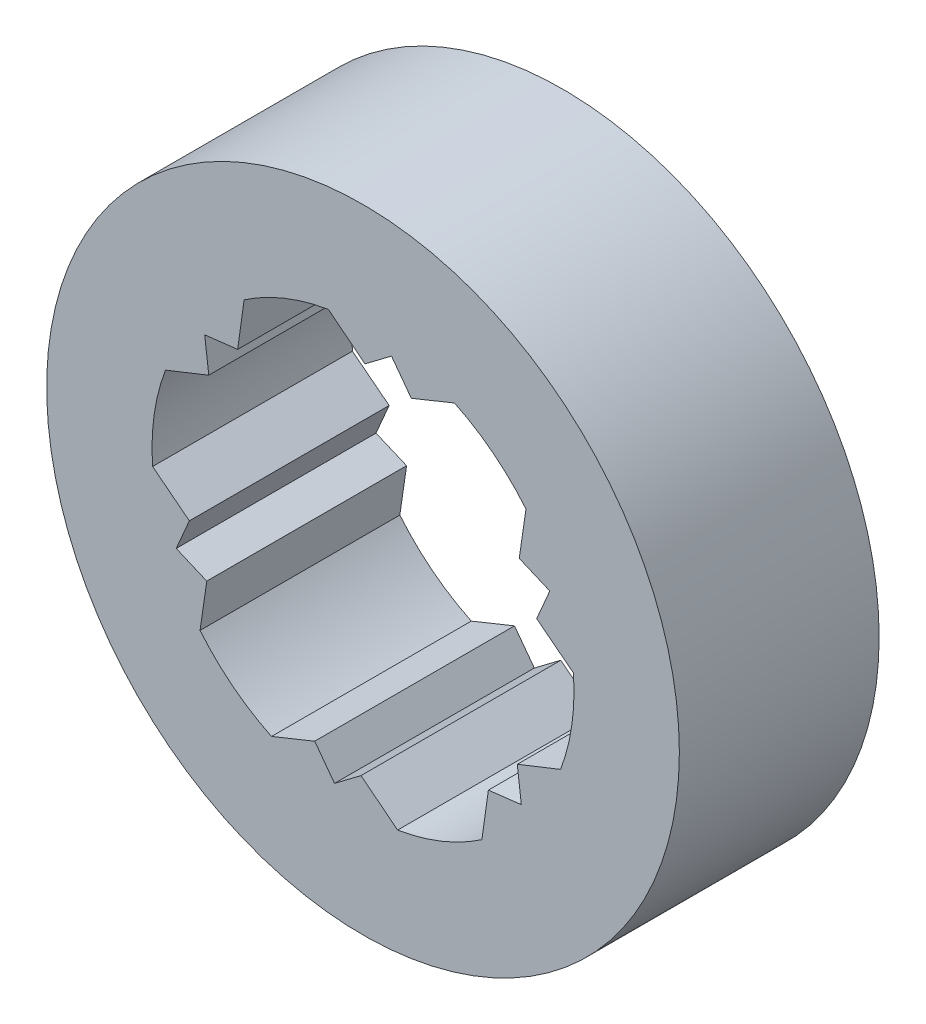
ISO-10303-21;
HEADER;
FILE_DESCRIPTION(('STEP AP214'),'2;1');
FILE_NAME('part.step','',(''),(''),'','','');
FILE_SCHEMA(('AUTOMOTIVE_DESIGN { 1 0 10303 214 1 1 1 1 }'));
ENDSEC;
DATA;
#1=APPLICATION_CONTEXT('core data for automotive mechanical design processes');
#2=APPLICATION_PROTOCOL_DEFINITION('international standard','automotive_design',2000,#1);
#3=PRODUCT_CONTEXT('',#1,'mechanical');
#4=PRODUCT('Part','Part','',(#3));
#5=PRODUCT_RELATED_PRODUCT_CATEGORY('part','',(#4));
#6=PRODUCT_DEFINITION_FORMATION('','',#4);
#7=PRODUCT_DEFINITION_CONTEXT('part definition',#1,'design');
#8=PRODUCT_DEFINITION('design','',#6,#7);
#9=PRODUCT_DEFINITION_SHAPE('','',#8);
#10=(LENGTH_UNIT() NAMED_UNIT(*) SI_UNIT(.MILLI.,.METRE.));
#11=(NAMED_UNIT(*) PLANE_ANGLE_UNIT() SI_UNIT($,.RADIAN.));
#12=(NAMED_UNIT(*) SI_UNIT($,.STERADIAN.) SOLID_ANGLE_UNIT());
#13=UNCERTAINTY_MEASURE_WITH_UNIT(LENGTH_MEASURE(1.E-05),#10,'distance_accuracy_value','');
#14=(GEOMETRIC_REPRESENTATION_CONTEXT(3) GLOBAL_UNCERTAINTY_ASSIGNED_CONTEXT((#13)) GLOBAL_UNIT_ASSIGNED_CONTEXT((#10,
#11,#12)) REPRESENTATION_CONTEXT('',''));
#15=CARTESIAN_POINT('',(0.,0.,0.));
#16=DIRECTION('',(0.,0.,1.));
#17=DIRECTION('',(1.,0.,0.));
#18=AXIS2_PLACEMENT_3D('',#15,#16,#17);
#19=CARTESIAN_POINT('',(-6.12693578866867,33.5955695744337,3.));
#20=DIRECTION('',(0.,0.,1.));
#21=DIRECTION('',(1.,0.,0.));
#22=AXIS2_PLACEMENT_3D('',#19,#20,#21);
#23=PLANE('',#22);
#24=CARTESIAN_POINT('',(-6.12693578866867,33.5955695744337,3.));
#25=DIRECTION('',(0.,0.,1.));
#26=DIRECTION('',(1.,0.,0.));
#27=AXIS2_PLACEMENT_3D('',#24,#25,#26);
#28=CIRCLE('',#27,4.74999999999999);
#29=CARTESIAN_POINT('',(-1.37693578866867,33.5955695744337,3.));
#30=VERTEX_POINT('',#29);
#31=EDGE_CURVE('E11',#30,#30,#28,.T.);
#32=ORIENTED_EDGE('',*,*,#31,.T.);
#33=EDGE_LOOP('',(#32));
#34=FACE_BOUND('',#33,.T.);
#35=DIRECTION('',(0.138449327742475,0.990369518739171,0.));
#36=VECTOR('',#35,1.);
#37=CARTESIAN_POINT('',(-4.24474359939464,31.6712928608779,3.));
#38=LINE('',#37,#36);
#39=CARTESIAN_POINT('',(-4.34165812881437,30.9780341977605,3.));
#40=VERTEX_POINT('',#39);
#41=CARTESIAN_POINT('',(-4.24474359939464,31.6712928608779,3.));
#42=VERTEX_POINT('',#41);
#43=EDGE_CURVE('E244',#40,#42,#38,.T.);
#44=ORIENTED_EDGE('',*,*,#43,.F.);
#45=CARTESIAN_POINT('',(-6.12693578866867,33.5955695744337,3.));
#46=DIRECTION('',(0.,0.,1.));
#47=DIRECTION('',(-1.,0.,0.));
#48=AXIS2_PLACEMENT_3D('',#45,#46,#47);
#49=CIRCLE('',#48,3.16839198504707);
#50=CARTESIAN_POINT('',(-5.60741686881472,30.4700603578701,3.));
#51=VERTEX_POINT('',#50);
#52=EDGE_CURVE('E236',#51,#40,#49,.T.);
#53=ORIENTED_EDGE('',*,*,#52,.F.);
#54=DIRECTION('',(0.784681674795164,-0.619898918567097,0.));
#55=VECTOR('',#54,1.);
#56=CARTESIAN_POINT('',(-6.15669404117133,30.903989600867,3.));
#57=LINE('',#56,#55);
#58=CARTESIAN_POINT('',(-6.15669404117133,30.903989600867,3.));
#59=VERTEX_POINT('',#58);
#60=EDGE_CURVE('E312',#59,#51,#57,.T.);
#61=ORIENTED_EDGE('',*,*,#60,.F.);
#62=DIRECTION('',(0.798195461078353,0.602398544083496,0.));
#63=VECTOR('',#62,1.);
#64=CARTESIAN_POINT('',(-6.55451593583498,30.6037532028472,3.));
#65=LINE('',#64,#63);
#66=CARTESIAN_POINT('',(-6.55451593583498,30.6037532028472,3.));
#67=VERTEX_POINT('',#66);
#68=EDGE_CURVE('E310',#67,#59,#65,.T.);
#69=ORIENTED_EDGE('',*,*,#68,.F.);
#70=DIRECTION('',(0.597502648936795,-0.801866936912549,0.));
#71=VECTOR('',#70,1.);
#72=CARTESIAN_POINT('',(-6.85231221188178,31.0034049669398,3.));
#73=LINE('',#72,#71);
#74=CARTESIAN_POINT('',(-6.85231221188178,31.0034049669398,3.));
#75=VERTEX_POINT('',#74);
#76=EDGE_CURVE('E308',#75,#67,#73,.T.);
#77=ORIENTED_EDGE('',*,*,#76,.F.);
#78=DIRECTION('',(0.926909826233128,0.375284124407726,0.));
#79=VECTOR('',#78,1.);
#80=CARTESIAN_POINT('',(-6.85231221188178,31.0034049669398,3.));
#81=LINE('',#80,#79);
#82=CARTESIAN_POINT('',(-7.50114909024496,30.7407060798544,3.));
#83=VERTEX_POINT('',#82);
#84=EDGE_CURVE('E306',#83,#75,#81,.T.);
#85=ORIENTED_EDGE('',*,*,#84,.F.);
#86=CARTESIAN_POINT('',(-6.12693578866867,33.5955695744337,3.));
#87=DIRECTION('',(0.,0.,1.));
#88=DIRECTION('',(1.,0.,0.));
#89=AXIS2_PLACEMENT_3D('',#86,#87,#88);
#90=CIRCLE('',#89,3.16839198504705);
#91=CARTESIAN_POINT('',(-8.5739467100482,31.5828983838117,3.));
#92=VERTEX_POINT('',#91);
#93=EDGE_CURVE('E304',#92,#83,#90,.T.);
#94=ORIENTED_EDGE('',*,*,#93,.F.);
#95=DIRECTION('',(-0.144507373860024,-0.98950372354028,0.));
#96=VECTOR('',#95,1.);
#97=CARTESIAN_POINT('',(-8.47279154834618,32.2755509902899,3.));
#98=LINE('',#97,#96);
#99=CARTESIAN_POINT('',(-8.47279154834618,32.2755509902899,3.));
#100=VERTEX_POINT('',#99);
#101=EDGE_CURVE('E302',#100,#92,#98,.T.);
#102=ORIENTED_EDGE('',*,*,#101,.F.);
#103=DIRECTION('',(0.920790172918248,-0.39005827443753,0.));
#104=VECTOR('',#103,1.);
#105=CARTESIAN_POINT('',(-8.9317148435039,32.4699566582404,3.));
#106=LINE('',#105,#104);
#107=CARTESIAN_POINT('',(-8.9317148435039,32.4699566582404,3.));
#108=VERTEX_POINT('',#107);
#109=EDGE_CURVE('E300',#108,#100,#106,.T.);
#110=ORIENTED_EDGE('',*,*,#109,.F.);
#111=DIRECTION('',(-0.395685813352689,-0.918385941264031,0.));
#112=VECTOR('',#111,1.);
#113=CARTESIAN_POINT('',(-8.73450440115582,32.9276816804956,3.));
#114=LINE('',#113,#112);
#115=CARTESIAN_POINT('',(-8.73450440115582,32.9276816804956,3.));
#116=VERTEX_POINT('',#115);
#117=EDGE_CURVE('E298',#116,#108,#114,.T.);
#118=ORIENTED_EDGE('',*,*,#117,.F.);
#119=DIRECTION('',(0.788460498490648,-0.615085394331453,0.));
#120=VECTOR('',#119,1.);
#121=CARTESIAN_POINT('',(-8.73450440115582,32.9276816804956,3.));
#122=LINE('',#121,#120);
#123=CARTESIAN_POINT('',(-9.28642675009927,33.3582414565276,3.));
#124=VERTEX_POINT('',#123);
#125=EDGE_CURVE('E296',#124,#116,#122,.T.);
#126=ORIENTED_EDGE('',*,*,#125,.F.);
#127=CARTESIAN_POINT('',(-6.12693578866867,33.5955695744337,3.));
#128=DIRECTION('',(0.,0.,1.));
#129=DIRECTION('',(1.,0.,0.));
#130=AXIS2_PLACEMENT_3D('',#127,#128,#129);
#131=CIRCLE('',#130,3.16839198504707);
#132=CARTESIAN_POINT('',(-9.09346562990216,34.7084076003753,3.));
#133=VERTEX_POINT('',#132);
#134=EDGE_CURVE('E294',#133,#124,#131,.T.);
#135=ORIENTED_EDGE('',*,*,#134,.F.);
#136=DIRECTION('',(-0.929189048655193,-0.369604804973173,0.));
#137=VECTOR('',#136,1.);
#138=CARTESIAN_POINT('',(-8.44303329584353,34.9671309638565,3.));
#139=LINE('',#138,#137);
#140=CARTESIAN_POINT('',(-8.44303329584353,34.9671309638565,3.));
#141=VERTEX_POINT('',#140);
#142=EDGE_CURVE('E292',#141,#133,#139,.T.);
#143=ORIENTED_EDGE('',*,*,#142,.F.);
#144=DIRECTION('',(0.122594711839903,-0.992456818521033,0.));
#145=VECTOR('',#144,1.);
#146=CARTESIAN_POINT('',(-8.5041346963376,35.4617730298268,3.));
#147=LINE('',#146,#145);
#148=CARTESIAN_POINT('',(-8.5041346963376,35.4617730298268,3.));
#149=VERTEX_POINT('',#148);
#150=EDGE_CURVE('E290',#149,#141,#147,.T.);
#151=ORIENTED_EDGE('',*,*,#150,.F.);
#152=DIRECTION('',(-0.993188462289481,-0.116519004351459,0.));
#153=VECTOR('',#152,1.);
#154=CARTESIAN_POINT('',(-8.00912797794273,35.5198462879894,3.));
#155=LINE('',#154,#153);
#156=CARTESIAN_POINT('',(-8.00912797794273,35.5198462879894,3.));
#157=VERTEX_POINT('',#156);
#158=EDGE_CURVE('E288',#157,#149,#155,.T.);
#159=ORIENTED_EDGE('',*,*,#158,.F.);
#160=DIRECTION('',(-0.138449327742475,-0.990369518739171,0.));
#161=VECTOR('',#160,1.);
#162=CARTESIAN_POINT('',(-8.00912797794273,35.5198462879894,3.));
#163=LINE('',#162,#161);
#164=CARTESIAN_POINT('',(-7.91221344852299,36.2131049511069,3.));
#165=VERTEX_POINT('',#164);
#166=EDGE_CURVE('E286',#165,#157,#163,.T.);
#167=ORIENTED_EDGE('',*,*,#166,.F.);
#168=CARTESIAN_POINT('',(-6.1269357886687,33.5955695744337,3.));
#169=DIRECTION('',(0.,0.,1.));
#170=DIRECTION('',(1.,0.,0.));
#171=AXIS2_PLACEMENT_3D('',#168,#169,#170);
#172=CIRCLE('',#171,3.16839198504705);
#173=CARTESIAN_POINT('',(-6.64645470852264,36.7210787909973,3.));
#174=VERTEX_POINT('',#173);
#175=EDGE_CURVE('E284',#174,#165,#172,.T.);
#176=ORIENTED_EDGE('',*,*,#175,.F.);
#177=DIRECTION('',(-0.784681674795159,0.619898918567104,0.));
#178=VECTOR('',#177,1.);
#179=CARTESIAN_POINT('',(-6.09717753616604,36.2871495480004,3.));
#180=LINE('',#179,#178);
#181=CARTESIAN_POINT('',(-6.09717753616604,36.2871495480004,3.));
#182=VERTEX_POINT('',#181);
#183=EDGE_CURVE('E282',#182,#174,#180,.T.);
#184=ORIENTED_EDGE('',*,*,#183,.F.);
#185=DIRECTION('',(-0.798195461078344,-0.602398544083508,0.));
#186=VECTOR('',#185,1.);
#187=CARTESIAN_POINT('',(-5.69935564150239,36.5873859460202,3.));
#188=LINE('',#187,#186);
#189=CARTESIAN_POINT('',(-5.69935564150239,36.5873859460202,3.));
#190=VERTEX_POINT('',#189);
#191=EDGE_CURVE('E280',#190,#182,#188,.T.);
#192=ORIENTED_EDGE('',*,*,#191,.F.);
#193=DIRECTION('',(-0.597502648936788,0.801866936912554,0.));
#194=VECTOR('',#193,1.);
#195=CARTESIAN_POINT('',(-5.40155936545559,36.1877341819275,3.));
#196=LINE('',#195,#194);
#197=CARTESIAN_POINT('',(-5.40155936545559,36.1877341819275,3.));
#198=VERTEX_POINT('',#197);
#199=EDGE_CURVE('E278',#198,#190,#196,.T.);
#200=ORIENTED_EDGE('',*,*,#199,.F.);
#201=DIRECTION('',(-0.926909826233127,-0.375284124407727,0.));
#202=VECTOR('',#201,1.);
#203=CARTESIAN_POINT('',(-5.40155936545559,36.1877341819275,3.));
#204=LINE('',#203,#202);
#205=CARTESIAN_POINT('',(-4.7527224870924,36.4504330690129,3.));
#206=VERTEX_POINT('',#205);
#207=EDGE_CURVE('E276',#206,#198,#204,.T.);
#208=ORIENTED_EDGE('',*,*,#207,.F.);
#209=CARTESIAN_POINT('',(-6.1269357886687,33.5955695744337,3.));
#210=DIRECTION('',(0.,0.,1.));
#211=DIRECTION('',(1.,0.,0.));
#212=AXIS2_PLACEMENT_3D('',#209,#210,#211);
#213=CIRCLE('',#212,3.16839198504707);
#214=CARTESIAN_POINT('',(-3.67992486728916,35.6082407650557,3.));
#215=VERTEX_POINT('',#214);
#216=EDGE_CURVE('E274',#215,#206,#213,.T.);
#217=ORIENTED_EDGE('',*,*,#216,.F.);
#218=DIRECTION('',(0.14450737386002,0.989503723540281,0.));
#219=VECTOR('',#218,1.);
#220=CARTESIAN_POINT('',(-3.78108002899118,34.9155881585775,3.));
#221=LINE('',#220,#219);
#222=CARTESIAN_POINT('',(-3.78108002899118,34.9155881585775,3.));
#223=VERTEX_POINT('',#222);
#224=EDGE_CURVE('E272',#223,#215,#221,.T.);
#225=ORIENTED_EDGE('',*,*,#224,.F.);
#226=DIRECTION('',(-0.920790172918252,0.390058274437518,0.));
#227=VECTOR('',#226,1.);
#228=CARTESIAN_POINT('',(-3.32215673383346,34.721182490627,3.));
#229=LINE('',#228,#227);
#230=CARTESIAN_POINT('',(-3.32215673383346,34.721182490627,3.));
#231=VERTEX_POINT('',#230);
#232=EDGE_CURVE('E270',#231,#223,#229,.T.);
#233=ORIENTED_EDGE('',*,*,#232,.F.);
#234=DIRECTION('',(0.39568581335269,0.918385941264031,0.));
#235=VECTOR('',#234,1.);
#236=CARTESIAN_POINT('',(-3.51936717618154,34.2634574683718,3.));
#237=LINE('',#236,#235);
#238=CARTESIAN_POINT('',(-3.51936717618154,34.2634574683718,3.));
#239=VERTEX_POINT('',#238);
#240=EDGE_CURVE('E268',#239,#231,#237,.T.);
#241=ORIENTED_EDGE('',*,*,#240,.F.);
#242=DIRECTION('',(-0.788460498490652,0.615085394331447,0.));
#243=VECTOR('',#242,1.);
#244=CARTESIAN_POINT('',(-3.51936717618154,34.2634574683718,3.));
#245=LINE('',#244,#243);
#246=CARTESIAN_POINT('',(-2.96744482723809,33.8328976923398,3.));
#247=VERTEX_POINT('',#246);
#248=EDGE_CURVE('E266',#247,#239,#245,.T.);
#249=ORIENTED_EDGE('',*,*,#248,.F.);
#250=CARTESIAN_POINT('',(-6.12693578866867,33.5955695744337,3.));
#251=DIRECTION('',(0.,0.,1.));
#252=DIRECTION('',(1.,0.,0.));
#253=AXIS2_PLACEMENT_3D('',#250,#251,#252);
#254=CIRCLE('',#253,3.16839198504705);
#255=CARTESIAN_POINT('',(-3.1604059474352,32.4827315484921,3.));
#256=VERTEX_POINT('',#255);
#257=EDGE_CURVE('E264',#256,#247,#254,.T.);
#258=ORIENTED_EDGE('',*,*,#257,.F.);
#259=DIRECTION('',(0.929189048655189,0.369604804973182,0.));
#260=VECTOR('',#259,1.);
#261=CARTESIAN_POINT('',(-3.81083828149383,32.2240081850108,3.));
#262=LINE('',#261,#260);
#263=CARTESIAN_POINT('',(-3.81083828149383,32.2240081850108,3.));
#264=VERTEX_POINT('',#263);
#265=EDGE_CURVE('E262',#264,#256,#262,.T.);
#266=ORIENTED_EDGE('',*,*,#265,.F.);
#267=DIRECTION('',(-0.122594711839907,0.992456818521033,0.));
#268=VECTOR('',#267,1.);
#269=CARTESIAN_POINT('',(-3.74973688099976,31.7293661190405,3.));
#270=LINE('',#269,#268);
#271=CARTESIAN_POINT('',(-3.74973688099976,31.7293661190405,3.));
#272=VERTEX_POINT('',#271);
#273=EDGE_CURVE('E258',#272,#264,#270,.T.);
#274=ORIENTED_EDGE('',*,*,#273,.F.);
#275=DIRECTION('',(0.993188462289478,0.116519004351486,0.));
#276=VECTOR('',#275,1.);
#277=CARTESIAN_POINT('',(-4.24474359939464,31.6712928608779,3.));
#278=LINE('',#277,#276);
#279=EDGE_CURVE('E256',#42,#272,#278,.T.);
#280=ORIENTED_EDGE('',*,*,#279,.F.);
#281=EDGE_LOOP('',(#44,#53,#61,#69,#77,#85,#94,#102,#110,#118,#126,#135,#143,#151,#159,#167,
#176,#184,#192,#200,#208,#217,#225,#233,#241,#249,#258,#266,#274,#280));
#282=FACE_BOUND('',#281,.T.);
#283=ADVANCED_FACE('F39',(#34,#282),#23,.T.);
#284=CARTESIAN_POINT('',(-6.12693578866867,33.5955695744337,0.));
#285=DIRECTION('',(0.,0.,1.));
#286=DIRECTION('',(1.,0.,0.));
#287=AXIS2_PLACEMENT_3D('',#284,#285,#286);
#288=PLANE('',#287);
#289=CARTESIAN_POINT('',(-6.12693578866867,33.5955695744337,0.));
#290=DIRECTION('',(0.,0.,1.));
#291=DIRECTION('',(1.,0.,0.));
#292=AXIS2_PLACEMENT_3D('',#289,#290,#291);
#293=CIRCLE('',#292,4.74999999999999);
#294=CARTESIAN_POINT('',(-1.37693578866867,33.5955695744337,0.));
#295=VERTEX_POINT('',#294);
#296=EDGE_CURVE('E43',#295,#295,#293,.T.);
#297=ORIENTED_EDGE('',*,*,#296,.F.);
#298=EDGE_LOOP('',(#297));
#299=FACE_BOUND('',#298,.T.);
#300=CARTESIAN_POINT('',(-6.12693578866867,33.5955695744337,0.));
#301=DIRECTION('',(0.,0.,1.));
#302=DIRECTION('',(-1.,0.,0.));
#303=AXIS2_PLACEMENT_3D('',#300,#301,#302);
#304=CIRCLE('',#303,3.16839198504707);
#305=CARTESIAN_POINT('',(-5.60741686881472,30.4700603578701,0.));
#306=VERTEX_POINT('',#305);
#307=CARTESIAN_POINT('',(-4.34165812881437,30.9780341977605,0.));
#308=VERTEX_POINT('',#307);
#309=EDGE_CURVE('E62',#306,#308,#304,.T.);
#310=ORIENTED_EDGE('',*,*,#309,.T.);
#311=DIRECTION('',(0.138449327742475,0.990369518739171,0.));
#312=VECTOR('',#311,1.);
#313=CARTESIAN_POINT('',(-4.24474359939464,31.6712928608779,0.));
#314=LINE('',#313,#312);
#315=CARTESIAN_POINT('',(-4.24474359939464,31.6712928608779,0.));
#316=VERTEX_POINT('',#315);
#317=EDGE_CURVE('E251',#308,#316,#314,.T.);
#318=ORIENTED_EDGE('',*,*,#317,.T.);
#319=DIRECTION('',(0.993188462289478,0.116519004351486,0.));
#320=VECTOR('',#319,1.);
#321=CARTESIAN_POINT('',(-4.24474359939464,31.6712928608779,0.));
#322=LINE('',#321,#320);
#323=CARTESIAN_POINT('',(-3.74973688099976,31.7293661190405,0.));
#324=VERTEX_POINT('',#323);
#325=EDGE_CURVE('E316',#316,#324,#322,.T.);
#326=ORIENTED_EDGE('',*,*,#325,.T.);
#327=DIRECTION('',(-0.122594711839907,0.992456818521033,0.));
#328=VECTOR('',#327,1.);
#329=CARTESIAN_POINT('',(-3.74973688099976,31.7293661190405,0.));
#330=LINE('',#329,#328);
#331=CARTESIAN_POINT('',(-3.81083828149383,32.2240081850108,0.));
#332=VERTEX_POINT('',#331);
#333=EDGE_CURVE('E319',#324,#332,#330,.T.);
#334=ORIENTED_EDGE('',*,*,#333,.T.);
#335=DIRECTION('',(0.929189048655189,0.369604804973182,0.));
#336=VECTOR('',#335,1.);
#337=CARTESIAN_POINT('',(-3.81083828149383,32.2240081850108,0.));
#338=LINE('',#337,#336);
#339=CARTESIAN_POINT('',(-3.1604059474352,32.4827315484921,0.));
#340=VERTEX_POINT('',#339);
#341=EDGE_CURVE('E322',#332,#340,#338,.T.);
#342=ORIENTED_EDGE('',*,*,#341,.T.);
#343=CARTESIAN_POINT('',(-6.12693578866867,33.5955695744337,0.));
#344=DIRECTION('',(0.,0.,1.));
#345=DIRECTION('',(1.,0.,0.));
#346=AXIS2_PLACEMENT_3D('',#343,#344,#345);
#347=CIRCLE('',#346,3.16839198504705);
#348=CARTESIAN_POINT('',(-2.96744482723809,33.8328976923398,0.));
#349=VERTEX_POINT('',#348);
#350=EDGE_CURVE('E325',#340,#349,#347,.T.);
#351=ORIENTED_EDGE('',*,*,#350,.T.);
#352=DIRECTION('',(-0.788460498490652,0.615085394331447,0.));
#353=VECTOR('',#352,1.);
#354=CARTESIAN_POINT('',(-3.51936717618154,34.2634574683718,0.));
#355=LINE('',#354,#353);
#356=CARTESIAN_POINT('',(-3.51936717618154,34.2634574683718,0.));
#357=VERTEX_POINT('',#356);
#358=EDGE_CURVE('E328',#349,#357,#355,.T.);
#359=ORIENTED_EDGE('',*,*,#358,.T.);
#360=DIRECTION('',(0.39568581335269,0.918385941264031,0.));
#361=VECTOR('',#360,1.);
#362=CARTESIAN_POINT('',(-3.51936717618154,34.2634574683718,0.));
#363=LINE('',#362,#361);
#364=CARTESIAN_POINT('',(-3.32215673383346,34.721182490627,0.));
#365=VERTEX_POINT('',#364);
#366=EDGE_CURVE('E331',#357,#365,#363,.T.);
#367=ORIENTED_EDGE('',*,*,#366,.T.);
#368=DIRECTION('',(-0.920790172918252,0.390058274437518,0.));
#369=VECTOR('',#368,1.);
#370=CARTESIAN_POINT('',(-3.32215673383346,34.721182490627,0.));
#371=LINE('',#370,#369);
#372=CARTESIAN_POINT('',(-3.78108002899118,34.9155881585775,0.));
#373=VERTEX_POINT('',#372);
#374=EDGE_CURVE('E334',#365,#373,#371,.T.);
#375=ORIENTED_EDGE('',*,*,#374,.T.);
#376=DIRECTION('',(0.14450737386002,0.989503723540281,0.));
#377=VECTOR('',#376,1.);
#378=CARTESIAN_POINT('',(-3.78108002899118,34.9155881585775,0.));
#379=LINE('',#378,#377);
#380=CARTESIAN_POINT('',(-3.67992486728916,35.6082407650557,0.));
#381=VERTEX_POINT('',#380);
#382=EDGE_CURVE('E337',#373,#381,#379,.T.);
#383=ORIENTED_EDGE('',*,*,#382,.T.);
#384=CARTESIAN_POINT('',(-6.1269357886687,33.5955695744337,0.));
#385=DIRECTION('',(0.,0.,1.));
#386=DIRECTION('',(1.,0.,0.));
#387=AXIS2_PLACEMENT_3D('',#384,#385,#386);
#388=CIRCLE('',#387,3.16839198504707);
#389=CARTESIAN_POINT('',(-4.7527224870924,36.4504330690129,0.));
#390=VERTEX_POINT('',#389);
#391=EDGE_CURVE('E340',#381,#390,#388,.T.);
#392=ORIENTED_EDGE('',*,*,#391,.T.);
#393=DIRECTION('',(-0.926909826233127,-0.375284124407727,0.));
#394=VECTOR('',#393,1.);
#395=CARTESIAN_POINT('',(-5.40155936545559,36.1877341819275,0.));
#396=LINE('',#395,#394);
#397=CARTESIAN_POINT('',(-5.40155936545559,36.1877341819275,0.));
#398=VERTEX_POINT('',#397);
#399=EDGE_CURVE('E343',#390,#398,#396,.T.);
#400=ORIENTED_EDGE('',*,*,#399,.T.);
#401=DIRECTION('',(-0.597502648936788,0.801866936912554,0.));
#402=VECTOR('',#401,1.);
#403=CARTESIAN_POINT('',(-5.40155936545559,36.1877341819275,0.));
#404=LINE('',#403,#402);
#405=CARTESIAN_POINT('',(-5.69935564150239,36.5873859460202,0.));
#406=VERTEX_POINT('',#405);
#407=EDGE_CURVE('E346',#398,#406,#404,.T.);
#408=ORIENTED_EDGE('',*,*,#407,.T.);
#409=DIRECTION('',(-0.798195461078344,-0.602398544083508,0.));
#410=VECTOR('',#409,1.);
#411=CARTESIAN_POINT('',(-5.69935564150239,36.5873859460202,0.));
#412=LINE('',#411,#410);
#413=CARTESIAN_POINT('',(-6.09717753616604,36.2871495480004,0.));
#414=VERTEX_POINT('',#413);
#415=EDGE_CURVE('E349',#406,#414,#412,.T.);
#416=ORIENTED_EDGE('',*,*,#415,.T.);
#417=DIRECTION('',(-0.784681674795159,0.619898918567104,0.));
#418=VECTOR('',#417,1.);
#419=CARTESIAN_POINT('',(-6.09717753616604,36.2871495480004,0.));
#420=LINE('',#419,#418);
#421=CARTESIAN_POINT('',(-6.64645470852264,36.7210787909973,0.));
#422=VERTEX_POINT('',#421);
#423=EDGE_CURVE('E352',#414,#422,#420,.T.);
#424=ORIENTED_EDGE('',*,*,#423,.T.);
#425=CARTESIAN_POINT('',(-6.1269357886687,33.5955695744337,0.));
#426=DIRECTION('',(0.,0.,1.));
#427=DIRECTION('',(1.,0.,0.));
#428=AXIS2_PLACEMENT_3D('',#425,#426,#427);
#429=CIRCLE('',#428,3.16839198504705);
#430=CARTESIAN_POINT('',(-7.91221344852299,36.2131049511069,0.));
#431=VERTEX_POINT('',#430);
#432=EDGE_CURVE('E355',#422,#431,#429,.T.);
#433=ORIENTED_EDGE('',*,*,#432,.T.);
#434=DIRECTION('',(-0.138449327742475,-0.990369518739171,0.));
#435=VECTOR('',#434,1.);
#436=CARTESIAN_POINT('',(-8.00912797794273,35.5198462879894,0.));
#437=LINE('',#436,#435);
#438=CARTESIAN_POINT('',(-8.00912797794273,35.5198462879894,0.));
#439=VERTEX_POINT('',#438);
#440=EDGE_CURVE('E358',#431,#439,#437,.T.);
#441=ORIENTED_EDGE('',*,*,#440,.T.);
#442=DIRECTION('',(-0.993188462289481,-0.116519004351459,0.));
#443=VECTOR('',#442,1.);
#444=CARTESIAN_POINT('',(-8.00912797794273,35.5198462879894,0.));
#445=LINE('',#444,#443);
#446=CARTESIAN_POINT('',(-8.5041346963376,35.4617730298268,0.));
#447=VERTEX_POINT('',#446);
#448=EDGE_CURVE('E361',#439,#447,#445,.T.);
#449=ORIENTED_EDGE('',*,*,#448,.T.);
#450=DIRECTION('',(0.122594711839903,-0.992456818521033,0.));
#451=VECTOR('',#450,1.);
#452=CARTESIAN_POINT('',(-8.5041346963376,35.4617730298268,0.));
#453=LINE('',#452,#451);
#454=CARTESIAN_POINT('',(-8.44303329584353,34.9671309638565,0.));
#455=VERTEX_POINT('',#454);
#456=EDGE_CURVE('E364',#447,#455,#453,.T.);
#457=ORIENTED_EDGE('',*,*,#456,.T.);
#458=DIRECTION('',(-0.929189048655193,-0.369604804973173,0.));
#459=VECTOR('',#458,1.);
#460=CARTESIAN_POINT('',(-8.44303329584353,34.9671309638565,0.));
#461=LINE('',#460,#459);
#462=CARTESIAN_POINT('',(-9.09346562990216,34.7084076003753,0.));
#463=VERTEX_POINT('',#462);
#464=EDGE_CURVE('E367',#455,#463,#461,.T.);
#465=ORIENTED_EDGE('',*,*,#464,.T.);
#466=CARTESIAN_POINT('',(-6.12693578866867,33.5955695744337,0.));
#467=DIRECTION('',(0.,0.,1.));
#468=DIRECTION('',(1.,0.,0.));
#469=AXIS2_PLACEMENT_3D('',#466,#467,#468);
#470=CIRCLE('',#469,3.16839198504707);
#471=CARTESIAN_POINT('',(-9.28642675009927,33.3582414565276,0.));
#472=VERTEX_POINT('',#471);
#473=EDGE_CURVE('E370',#463,#472,#470,.T.);
#474=ORIENTED_EDGE('',*,*,#473,.T.);
#475=DIRECTION('',(0.788460498490648,-0.615085394331453,0.));
#476=VECTOR('',#475,1.);
#477=CARTESIAN_POINT('',(-8.73450440115582,32.9276816804956,0.));
#478=LINE('',#477,#476);
#479=CARTESIAN_POINT('',(-8.73450440115582,32.9276816804956,0.));
#480=VERTEX_POINT('',#479);
#481=EDGE_CURVE('E373',#472,#480,#478,.T.);
#482=ORIENTED_EDGE('',*,*,#481,.T.);
#483=DIRECTION('',(-0.395685813352689,-0.918385941264031,0.));
#484=VECTOR('',#483,1.);
#485=CARTESIAN_POINT('',(-8.73450440115582,32.9276816804956,0.));
#486=LINE('',#485,#484);
#487=CARTESIAN_POINT('',(-8.9317148435039,32.4699566582404,0.));
#488=VERTEX_POINT('',#487);
#489=EDGE_CURVE('E376',#480,#488,#486,.T.);
#490=ORIENTED_EDGE('',*,*,#489,.T.);
#491=DIRECTION('',(0.920790172918248,-0.39005827443753,0.));
#492=VECTOR('',#491,1.);
#493=CARTESIAN_POINT('',(-8.9317148435039,32.4699566582404,0.));
#494=LINE('',#493,#492);
#495=CARTESIAN_POINT('',(-8.47279154834618,32.2755509902899,0.));
#496=VERTEX_POINT('',#495);
#497=EDGE_CURVE('E379',#488,#496,#494,.T.);
#498=ORIENTED_EDGE('',*,*,#497,.T.);
#499=DIRECTION('',(-0.144507373860024,-0.98950372354028,0.));
#500=VECTOR('',#499,1.);
#501=CARTESIAN_POINT('',(-8.47279154834618,32.2755509902899,0.));
#502=LINE('',#501,#500);
#503=CARTESIAN_POINT('',(-8.5739467100482,31.5828983838117,0.));
#504=VERTEX_POINT('',#503);
#505=EDGE_CURVE('E382',#496,#504,#502,.T.);
#506=ORIENTED_EDGE('',*,*,#505,.T.);
#507=CARTESIAN_POINT('',(-6.12693578866867,33.5955695744337,0.));
#508=DIRECTION('',(0.,0.,1.));
#509=DIRECTION('',(1.,0.,0.));
#510=AXIS2_PLACEMENT_3D('',#507,#508,#509);
#511=CIRCLE('',#510,3.16839198504705);
#512=CARTESIAN_POINT('',(-7.50114909024496,30.7407060798544,0.));
#513=VERTEX_POINT('',#512);
#514=EDGE_CURVE('E385',#504,#513,#511,.T.);
#515=ORIENTED_EDGE('',*,*,#514,.T.);
#516=DIRECTION('',(0.926909826233128,0.375284124407726,0.));
#517=VECTOR('',#516,1.);
#518=CARTESIAN_POINT('',(-6.85231221188178,31.0034049669398,0.));
#519=LINE('',#518,#517);
#520=CARTESIAN_POINT('',(-6.85231221188178,31.0034049669398,0.));
#521=VERTEX_POINT('',#520);
#522=EDGE_CURVE('E388',#513,#521,#519,.T.);
#523=ORIENTED_EDGE('',*,*,#522,.T.);
#524=DIRECTION('',(0.597502648936795,-0.801866936912549,0.));
#525=VECTOR('',#524,1.);
#526=CARTESIAN_POINT('',(-6.85231221188178,31.0034049669398,0.));
#527=LINE('',#526,#525);
#528=CARTESIAN_POINT('',(-6.55451593583498,30.6037532028472,0.));
#529=VERTEX_POINT('',#528);
#530=EDGE_CURVE('E391',#521,#529,#527,.T.);
#531=ORIENTED_EDGE('',*,*,#530,.T.);
#532=DIRECTION('',(0.798195461078353,0.602398544083496,0.));
#533=VECTOR('',#532,1.);
#534=CARTESIAN_POINT('',(-6.55451593583498,30.6037532028472,0.));
#535=LINE('',#534,#533);
#536=CARTESIAN_POINT('',(-6.15669404117133,30.903989600867,0.));
#537=VERTEX_POINT('',#536);
#538=EDGE_CURVE('E394',#529,#537,#535,.T.);
#539=ORIENTED_EDGE('',*,*,#538,.T.);
#540=DIRECTION('',(0.784681674795164,-0.619898918567097,0.));
#541=VECTOR('',#540,1.);
#542=CARTESIAN_POINT('',(-6.15669404117133,30.903989600867,0.));
#543=LINE('',#542,#541);
#544=EDGE_CURVE('E245',#537,#306,#543,.T.);
#545=ORIENTED_EDGE('',*,*,#544,.T.);
#546=EDGE_LOOP('',(#310,#318,#326,#334,#342,#351,#359,#367,#375,#383,#392,#400,#408,#416,#424,
#433,#441,#449,#457,#465,#474,#482,#490,#498,#506,#515,#523,#531,#539,#545));
#547=FACE_BOUND('',#546,.T.);
#548=ADVANCED_FACE('F459',(#299,#547),#288,.F.);
#549=CARTESIAN_POINT('',(-6.12693578866867,33.5955695744337,3.));
#550=DIRECTION('',(0.,0.,-1.));
#551=DIRECTION('',(-1.,0.,0.));
#552=AXIS2_PLACEMENT_3D('',#549,#550,#551);
#553=CYLINDRICAL_SURFACE('',#552,4.74999999999999);
#554=ORIENTED_EDGE('',*,*,#31,.F.);
#555=EDGE_LOOP('',(#554));
#556=FACE_BOUND('',#555,.T.);
#557=ORIENTED_EDGE('',*,*,#296,.T.);
#558=EDGE_LOOP('',(#557));
#559=FACE_BOUND('',#558,.T.);
#560=ADVANCED_FACE('F41',(#556,#559),#553,.T.);
#561=CARTESIAN_POINT('',(-6.12693578866867,33.5955695744337,3.));
#562=DIRECTION('',(0.,0.,-1.));
#563=DIRECTION('',(-1.,0.,0.));
#564=AXIS2_PLACEMENT_3D('',#561,#562,#563);
#565=CYLINDRICAL_SURFACE('',#564,3.16839198504707);
#566=ORIENTED_EDGE('',*,*,#309,.F.);
#567=DIRECTION('',(0.,0.,-1.));
#568=VECTOR('',#567,1.);
#569=CARTESIAN_POINT('',(-5.60741686881472,30.4700603578701,3.));
#570=LINE('',#569,#568);
#571=EDGE_CURVE('E240',#51,#306,#570,.T.);
#572=ORIENTED_EDGE('',*,*,#571,.F.);
#573=ORIENTED_EDGE('',*,*,#52,.T.);
#574=DIRECTION('',(0.,0.,-1.));
#575=VECTOR('',#574,1.);
#576=CARTESIAN_POINT('',(-4.34165812881437,30.9780341977605,3.));
#577=LINE('',#576,#575);
#578=EDGE_CURVE('E239',#40,#308,#577,.T.);
#579=ORIENTED_EDGE('',*,*,#578,.T.);
#580=EDGE_LOOP('',(#566,#572,#573,#579));
#581=FACE_BOUND('',#580,.T.);
#582=ADVANCED_FACE('F238',(#581),#565,.F.);
#583=CARTESIAN_POINT('',(-4.24474359939464,31.6712928608779,3.));
#584=DIRECTION('',(-0.990369518739171,0.138449327742475,0.));
#585=DIRECTION('',(-0.138449327742475,-0.990369518739171,0.));
#586=AXIS2_PLACEMENT_3D('',#583,#584,#585);
#587=PLANE('',#586);
#588=ORIENTED_EDGE('',*,*,#317,.F.);
#589=ORIENTED_EDGE('',*,*,#578,.F.);
#590=ORIENTED_EDGE('',*,*,#43,.T.);
#591=DIRECTION('',(0.,0.,-1.));
#592=VECTOR('',#591,1.);
#593=CARTESIAN_POINT('',(-4.24474359939464,31.6712928608779,3.));
#594=LINE('',#593,#592);
#595=EDGE_CURVE('E252',#42,#316,#594,.T.);
#596=ORIENTED_EDGE('',*,*,#595,.T.);
#597=EDGE_LOOP('',(#588,#589,#590,#596));
#598=FACE_BOUND('',#597,.T.);
#599=ADVANCED_FACE('F248',(#598),#587,.T.);
#600=CARTESIAN_POINT('',(-4.24474359939464,31.6712928608779,3.));
#601=DIRECTION('',(-0.116519004351486,0.993188462289478,0.));
#602=DIRECTION('',(-0.993188462289478,-0.116519004351486,0.));
#603=AXIS2_PLACEMENT_3D('',#600,#601,#602);
#604=PLANE('',#603);
#605=ORIENTED_EDGE('',*,*,#325,.F.);
#606=ORIENTED_EDGE('',*,*,#595,.F.);
#607=ORIENTED_EDGE('',*,*,#279,.T.);
#608=DIRECTION('',(0.,0.,-1.));
#609=VECTOR('',#608,1.);
#610=CARTESIAN_POINT('',(-3.74973688099976,31.7293661190405,3.));
#611=LINE('',#610,#609);
#612=EDGE_CURVE('E451',#272,#324,#611,.T.);
#613=ORIENTED_EDGE('',*,*,#612,.T.);
#614=EDGE_LOOP('',(#605,#606,#607,#613));
#615=FACE_BOUND('',#614,.T.);
#616=ADVANCED_FACE('F455',(#615),#604,.T.);
#617=CARTESIAN_POINT('',(-3.74973688099976,31.7293661190405,3.));
#618=DIRECTION('',(-0.992456818521033,-0.122594711839907,0.));
#619=DIRECTION('',(0.122594711839907,-0.992456818521033,0.));
#620=AXIS2_PLACEMENT_3D('',#617,#618,#619);
#621=PLANE('',#620);
#622=ORIENTED_EDGE('',*,*,#333,.F.);
#623=ORIENTED_EDGE('',*,*,#612,.F.);
#624=ORIENTED_EDGE('',*,*,#273,.T.);
#625=DIRECTION('',(0.,0.,-1.));
#626=VECTOR('',#625,1.);
#627=CARTESIAN_POINT('',(-3.81083828149383,32.2240081850108,3.));
#628=LINE('',#627,#626);
#629=EDGE_CURVE('E449',#264,#332,#628,.T.);
#630=ORIENTED_EDGE('',*,*,#629,.T.);
#631=EDGE_LOOP('',(#622,#623,#624,#630));
#632=FACE_BOUND('',#631,.T.);
#633=ADVANCED_FACE('F587',(#632),#621,.T.);
#634=CARTESIAN_POINT('',(-3.81083828149383,32.2240081850108,3.));
#635=DIRECTION('',(-0.369604804973182,0.92918904865519,0.));
#636=DIRECTION('',(-0.92918904865519,-0.369604804973182,0.));
#637=AXIS2_PLACEMENT_3D('',#634,#635,#636);
#638=PLANE('',#637);
#639=ORIENTED_EDGE('',*,*,#341,.F.);
#640=ORIENTED_EDGE('',*,*,#629,.F.);
#641=ORIENTED_EDGE('',*,*,#265,.T.);
#642=DIRECTION('',(0.,0.,-1.));
#643=VECTOR('',#642,1.);
#644=CARTESIAN_POINT('',(-3.1604059474352,32.4827315484921,3.));
#645=LINE('',#644,#643);
#646=EDGE_CURVE('E447',#256,#340,#645,.T.);
#647=ORIENTED_EDGE('',*,*,#646,.T.);
#648=EDGE_LOOP('',(#639,#640,#641,#647));
#649=FACE_BOUND('',#648,.T.);
#650=ADVANCED_FACE('F585',(#649),#638,.T.);
#651=CARTESIAN_POINT('',(-6.12693578866867,33.5955695744337,3.));
#652=DIRECTION('',(0.,0.,-1.));
#653=DIRECTION('',(-1.,0.,0.));
#654=AXIS2_PLACEMENT_3D('',#651,#652,#653);
#655=CYLINDRICAL_SURFACE('',#654,3.16839198504705);
#656=ORIENTED_EDGE('',*,*,#350,.F.);
#657=ORIENTED_EDGE('',*,*,#646,.F.);
#658=ORIENTED_EDGE('',*,*,#257,.T.);
#659=DIRECTION('',(0.,0.,-1.));
#660=VECTOR('',#659,1.);
#661=CARTESIAN_POINT('',(-2.96744482723809,33.8328976923398,3.));
#662=LINE('',#661,#660);
#663=EDGE_CURVE('E445',#247,#349,#662,.T.);
#664=ORIENTED_EDGE('',*,*,#663,.T.);
#665=EDGE_LOOP('',(#656,#657,#658,#664));
#666=FACE_BOUND('',#665,.T.);
#667=ADVANCED_FACE('F579',(#666),#655,.F.);
#668=CARTESIAN_POINT('',(-3.51936717618154,34.2634574683718,3.));
#669=DIRECTION('',(-0.615085394331447,-0.788460498490652,0.));
#670=DIRECTION('',(0.788460498490652,-0.615085394331447,0.));
#671=AXIS2_PLACEMENT_3D('',#668,#669,#670);
#672=PLANE('',#671);
#673=ORIENTED_EDGE('',*,*,#358,.F.);
#674=ORIENTED_EDGE('',*,*,#663,.F.);
#675=ORIENTED_EDGE('',*,*,#248,.T.);
#676=DIRECTION('',(0.,0.,-1.));
#677=VECTOR('',#676,1.);
#678=CARTESIAN_POINT('',(-3.51936717618154,34.2634574683718,3.));
#679=LINE('',#678,#677);
#680=EDGE_CURVE('E443',#239,#357,#679,.T.);
#681=ORIENTED_EDGE('',*,*,#680,.T.);
#682=EDGE_LOOP('',(#673,#674,#675,#681));
#683=FACE_BOUND('',#682,.T.);
#684=ADVANCED_FACE('F575',(#683),#672,.T.);
#685=CARTESIAN_POINT('',(-3.51936717618154,34.2634574683718,3.));
#686=DIRECTION('',(-0.918385941264031,0.39568581335269,0.));
#687=DIRECTION('',(-0.39568581335269,-0.918385941264031,0.));
#688=AXIS2_PLACEMENT_3D('',#685,#686,#687);
#689=PLANE('',#688);
#690=ORIENTED_EDGE('',*,*,#366,.F.);
#691=ORIENTED_EDGE('',*,*,#680,.F.);
#692=ORIENTED_EDGE('',*,*,#240,.T.);
#693=DIRECTION('',(0.,0.,-1.));
#694=VECTOR('',#693,1.);
#695=CARTESIAN_POINT('',(-3.32215673383346,34.721182490627,3.));
#696=LINE('',#695,#694);
#697=EDGE_CURVE('E441',#231,#365,#696,.T.);
#698=ORIENTED_EDGE('',*,*,#697,.T.);
#699=EDGE_LOOP('',(#690,#691,#692,#698));
#700=FACE_BOUND('',#699,.T.);
#701=ADVANCED_FACE('F572',(#700),#689,.T.);
#702=CARTESIAN_POINT('',(-3.32215673383346,34.721182490627,3.));
#703=DIRECTION('',(-0.390058274437518,-0.920790172918253,0.));
#704=DIRECTION('',(0.920790172918253,-0.390058274437518,0.));
#705=AXIS2_PLACEMENT_3D('',#702,#703,#704);
#706=PLANE('',#705);
#707=ORIENTED_EDGE('',*,*,#374,.F.);
#708=ORIENTED_EDGE('',*,*,#697,.F.);
#709=ORIENTED_EDGE('',*,*,#232,.T.);
#710=DIRECTION('',(0.,0.,-1.));
#711=VECTOR('',#710,1.);
#712=CARTESIAN_POINT('',(-3.78108002899118,34.9155881585775,3.));
#713=LINE('',#712,#711);
#714=EDGE_CURVE('E439',#223,#373,#713,.T.);
#715=ORIENTED_EDGE('',*,*,#714,.T.);
#716=EDGE_LOOP('',(#707,#708,#709,#715));
#717=FACE_BOUND('',#716,.T.);
#718=ADVANCED_FACE('F564',(#717),#706,.T.);
#719=CARTESIAN_POINT('',(-3.78108002899118,34.9155881585775,3.));
#720=DIRECTION('',(-0.989503723540281,0.14450737386002,0.));
#721=DIRECTION('',(-0.14450737386002,-0.989503723540281,0.));
#722=AXIS2_PLACEMENT_3D('',#719,#720,#721);
#723=PLANE('',#722);
#724=ORIENTED_EDGE('',*,*,#382,.F.);
#725=ORIENTED_EDGE('',*,*,#714,.F.);
#726=ORIENTED_EDGE('',*,*,#224,.T.);
#727=DIRECTION('',(0.,0.,-1.));
#728=VECTOR('',#727,1.);
#729=CARTESIAN_POINT('',(-3.67992486728916,35.6082407650557,3.));
#730=LINE('',#729,#728);
#731=EDGE_CURVE('E437',#215,#381,#730,.T.);
#732=ORIENTED_EDGE('',*,*,#731,.T.);
#733=EDGE_LOOP('',(#724,#725,#726,#732));
#734=FACE_BOUND('',#733,.T.);
#735=ADVANCED_FACE('F560',(#734),#723,.T.);
#736=CARTESIAN_POINT('',(-6.1269357886687,33.5955695744337,3.));
#737=DIRECTION('',(0.,0.,-1.));
#738=DIRECTION('',(-1.,0.,0.));
#739=AXIS2_PLACEMENT_3D('',#736,#737,#738);
#740=CYLINDRICAL_SURFACE('',#739,3.16839198504707);
#741=ORIENTED_EDGE('',*,*,#391,.F.);
#742=ORIENTED_EDGE('',*,*,#731,.F.);
#743=ORIENTED_EDGE('',*,*,#216,.T.);
#744=DIRECTION('',(0.,0.,-1.));
#745=VECTOR('',#744,1.);
#746=CARTESIAN_POINT('',(-4.7527224870924,36.4504330690129,3.));
#747=LINE('',#746,#745);
#748=EDGE_CURVE('E435',#206,#390,#747,.T.);
#749=ORIENTED_EDGE('',*,*,#748,.T.);
#750=EDGE_LOOP('',(#741,#742,#743,#749));
#751=FACE_BOUND('',#750,.T.);
#752=ADVANCED_FACE('F557',(#751),#740,.F.);
#753=CARTESIAN_POINT('',(-5.40155936545559,36.1877341819275,3.));
#754=DIRECTION('',(0.375284124407727,-0.926909826233127,0.));
#755=DIRECTION('',(0.926909826233127,0.375284124407727,0.));
#756=AXIS2_PLACEMENT_3D('',#753,#754,#755);
#757=PLANE('',#756);
#758=ORIENTED_EDGE('',*,*,#399,.F.);
#759=ORIENTED_EDGE('',*,*,#748,.F.);
#760=ORIENTED_EDGE('',*,*,#207,.T.);
#761=DIRECTION('',(0.,0.,-1.));
#762=VECTOR('',#761,1.);
#763=CARTESIAN_POINT('',(-5.40155936545559,36.1877341819275,3.));
#764=LINE('',#763,#762);
#765=EDGE_CURVE('E433',#198,#398,#764,.T.);
#766=ORIENTED_EDGE('',*,*,#765,.T.);
#767=EDGE_LOOP('',(#758,#759,#760,#766));
#768=FACE_BOUND('',#767,.T.);
#769=ADVANCED_FACE('F549',(#768),#757,.T.);
#770=CARTESIAN_POINT('',(-5.40155936545559,36.1877341819275,3.));
#771=DIRECTION('',(-0.801866936912554,-0.597502648936788,0.));
#772=DIRECTION('',(0.597502648936788,-0.801866936912554,0.));
#773=AXIS2_PLACEMENT_3D('',#770,#771,#772);
#774=PLANE('',#773);
#775=ORIENTED_EDGE('',*,*,#407,.F.);
#776=ORIENTED_EDGE('',*,*,#765,.F.);
#777=ORIENTED_EDGE('',*,*,#199,.T.);
#778=DIRECTION('',(0.,0.,-1.));
#779=VECTOR('',#778,1.);
#780=CARTESIAN_POINT('',(-5.69935564150239,36.5873859460202,3.));
#781=LINE('',#780,#779);
#782=EDGE_CURVE('E431',#190,#406,#781,.T.);
#783=ORIENTED_EDGE('',*,*,#782,.T.);
#784=EDGE_LOOP('',(#775,#776,#777,#783));
#785=FACE_BOUND('',#784,.T.);
#786=ADVANCED_FACE('F545',(#785),#774,.T.);
#787=CARTESIAN_POINT('',(-5.69935564150239,36.5873859460202,3.));
#788=DIRECTION('',(0.602398544083508,-0.798195461078344,0.));
#789=DIRECTION('',(0.798195461078344,0.602398544083508,0.));
#790=AXIS2_PLACEMENT_3D('',#787,#788,#789);
#791=PLANE('',#790);
#792=ORIENTED_EDGE('',*,*,#415,.F.);
#793=ORIENTED_EDGE('',*,*,#782,.F.);
#794=ORIENTED_EDGE('',*,*,#191,.T.);
#795=DIRECTION('',(0.,0.,-1.));
#796=VECTOR('',#795,1.);
#797=CARTESIAN_POINT('',(-6.09717753616604,36.2871495480004,3.));
#798=LINE('',#797,#796);
#799=EDGE_CURVE('E429',#182,#414,#798,.T.);
#800=ORIENTED_EDGE('',*,*,#799,.T.);
#801=EDGE_LOOP('',(#792,#793,#794,#800));
#802=FACE_BOUND('',#801,.T.);
#803=ADVANCED_FACE('F542',(#802),#791,.T.);
#804=CARTESIAN_POINT('',(-6.09717753616604,36.2871495480004,3.));
#805=DIRECTION('',(-0.619898918567104,-0.784681674795159,0.));
#806=DIRECTION('',(0.784681674795159,-0.619898918567104,0.));
#807=AXIS2_PLACEMENT_3D('',#804,#805,#806);
#808=PLANE('',#807);
#809=ORIENTED_EDGE('',*,*,#423,.F.);
#810=ORIENTED_EDGE('',*,*,#799,.F.);
#811=ORIENTED_EDGE('',*,*,#183,.T.);
#812=DIRECTION('',(0.,0.,-1.));
#813=VECTOR('',#812,1.);
#814=CARTESIAN_POINT('',(-6.64645470852264,36.7210787909973,3.));
#815=LINE('',#814,#813);
#816=EDGE_CURVE('E427',#174,#422,#815,.T.);
#817=ORIENTED_EDGE('',*,*,#816,.T.);
#818=EDGE_LOOP('',(#809,#810,#811,#817));
#819=FACE_BOUND('',#818,.T.);
#820=ADVANCED_FACE('F534',(#819),#808,.T.);
#821=CARTESIAN_POINT('',(-6.1269357886687,33.5955695744337,3.));
#822=DIRECTION('',(0.,0.,-1.));
#823=DIRECTION('',(-1.,0.,0.));
#824=AXIS2_PLACEMENT_3D('',#821,#822,#823);
#825=CYLINDRICAL_SURFACE('',#824,3.16839198504705);
#826=ORIENTED_EDGE('',*,*,#432,.F.);
#827=ORIENTED_EDGE('',*,*,#816,.F.);
#828=ORIENTED_EDGE('',*,*,#175,.T.);
#829=DIRECTION('',(0.,0.,-1.));
#830=VECTOR('',#829,1.);
#831=CARTESIAN_POINT('',(-7.91221344852299,36.2131049511069,3.));
#832=LINE('',#831,#830);
#833=EDGE_CURVE('E425',#165,#431,#832,.T.);
#834=ORIENTED_EDGE('',*,*,#833,.T.);
#835=EDGE_LOOP('',(#826,#827,#828,#834));
#836=FACE_BOUND('',#835,.T.);
#837=ADVANCED_FACE('F530',(#836),#825,.F.);
#838=CARTESIAN_POINT('',(-8.00912797794273,35.5198462879894,3.));
#839=DIRECTION('',(0.990369518739171,-0.138449327742475,0.));
#840=DIRECTION('',(0.138449327742475,0.990369518739171,0.));
#841=AXIS2_PLACEMENT_3D('',#838,#839,#840);
#842=PLANE('',#841);
#843=ORIENTED_EDGE('',*,*,#440,.F.);
#844=ORIENTED_EDGE('',*,*,#833,.F.);
#845=ORIENTED_EDGE('',*,*,#166,.T.);
#846=DIRECTION('',(0.,0.,-1.));
#847=VECTOR('',#846,1.);
#848=CARTESIAN_POINT('',(-8.00912797794273,35.5198462879894,3.));
#849=LINE('',#848,#847);
#850=EDGE_CURVE('E423',#157,#439,#849,.T.);
#851=ORIENTED_EDGE('',*,*,#850,.T.);
#852=EDGE_LOOP('',(#843,#844,#845,#851));
#853=FACE_BOUND('',#852,.T.);
#854=ADVANCED_FACE('F527',(#853),#842,.T.);
#855=CARTESIAN_POINT('',(-8.00912797794273,35.5198462879894,3.));
#856=DIRECTION('',(0.116519004351459,-0.993188462289481,0.));
#857=DIRECTION('',(0.993188462289481,0.116519004351459,0.));
#858=AXIS2_PLACEMENT_3D('',#855,#856,#857);
#859=PLANE('',#858);
#860=ORIENTED_EDGE('',*,*,#448,.F.);
#861=ORIENTED_EDGE('',*,*,#850,.F.);
#862=ORIENTED_EDGE('',*,*,#158,.T.);
#863=DIRECTION('',(0.,0.,-1.));
#864=VECTOR('',#863,1.);
#865=CARTESIAN_POINT('',(-8.5041346963376,35.4617730298268,3.));
#866=LINE('',#865,#864);
#867=EDGE_CURVE('E421',#149,#447,#866,.T.);
#868=ORIENTED_EDGE('',*,*,#867,.T.);
#869=EDGE_LOOP('',(#860,#861,#862,#868));
#870=FACE_BOUND('',#869,.T.);
#871=ADVANCED_FACE('F519',(#870),#859,.T.);
#872=CARTESIAN_POINT('',(-8.5041346963376,35.4617730298268,3.));
#873=DIRECTION('',(0.992456818521033,0.122594711839903,0.));
#874=DIRECTION('',(-0.122594711839903,0.992456818521033,0.));
#875=AXIS2_PLACEMENT_3D('',#872,#873,#874);
#876=PLANE('',#875);
#877=ORIENTED_EDGE('',*,*,#456,.F.);
#878=ORIENTED_EDGE('',*,*,#867,.F.);
#879=ORIENTED_EDGE('',*,*,#150,.T.);
#880=DIRECTION('',(0.,0.,-1.));
#881=VECTOR('',#880,1.);
#882=CARTESIAN_POINT('',(-8.44303329584353,34.9671309638565,3.));
#883=LINE('',#882,#881);
#884=EDGE_CURVE('E419',#141,#455,#883,.T.);
#885=ORIENTED_EDGE('',*,*,#884,.T.);
#886=EDGE_LOOP('',(#877,#878,#879,#885));
#887=FACE_BOUND('',#886,.T.);
#888=ADVANCED_FACE('F515',(#887),#876,.T.);
#889=CARTESIAN_POINT('',(-8.44303329584353,34.9671309638565,3.));
#890=DIRECTION('',(0.369604804973172,-0.929189048655193,0.));
#891=DIRECTION('',(0.929189048655193,0.369604804973172,0.));
#892=AXIS2_PLACEMENT_3D('',#889,#890,#891);
#893=PLANE('',#892);
#894=ORIENTED_EDGE('',*,*,#464,.F.);
#895=ORIENTED_EDGE('',*,*,#884,.F.);
#896=ORIENTED_EDGE('',*,*,#142,.T.);
#897=DIRECTION('',(0.,0.,-1.));
#898=VECTOR('',#897,1.);
#899=CARTESIAN_POINT('',(-9.09346562990216,34.7084076003753,3.));
#900=LINE('',#899,#898);
#901=EDGE_CURVE('E417',#133,#463,#900,.T.);
#902=ORIENTED_EDGE('',*,*,#901,.T.);
#903=EDGE_LOOP('',(#894,#895,#896,#902));
#904=FACE_BOUND('',#903,.T.);
#905=ADVANCED_FACE('F512',(#904),#893,.T.);
#906=CARTESIAN_POINT('',(-6.12693578866867,33.5955695744337,3.));
#907=DIRECTION('',(0.,0.,-1.));
#908=DIRECTION('',(-1.,0.,0.));
#909=AXIS2_PLACEMENT_3D('',#906,#907,#908);
#910=CYLINDRICAL_SURFACE('',#909,3.16839198504707);
#911=ORIENTED_EDGE('',*,*,#473,.F.);
#912=ORIENTED_EDGE('',*,*,#901,.F.);
#913=ORIENTED_EDGE('',*,*,#134,.T.);
#914=DIRECTION('',(0.,0.,-1.));
#915=VECTOR('',#914,1.);
#916=CARTESIAN_POINT('',(-9.28642675009927,33.3582414565276,3.));
#917=LINE('',#916,#915);
#918=EDGE_CURVE('E415',#124,#472,#917,.T.);
#919=ORIENTED_EDGE('',*,*,#918,.T.);
#920=EDGE_LOOP('',(#911,#912,#913,#919));
#921=FACE_BOUND('',#920,.T.);
#922=ADVANCED_FACE('F504',(#921),#910,.F.);
#923=CARTESIAN_POINT('',(-8.73450440115582,32.9276816804956,3.));
#924=DIRECTION('',(0.615085394331453,0.788460498490648,0.));
#925=DIRECTION('',(-0.788460498490648,0.615085394331453,0.));
#926=AXIS2_PLACEMENT_3D('',#923,#924,#925);
#927=PLANE('',#926);
#928=ORIENTED_EDGE('',*,*,#481,.F.);
#929=ORIENTED_EDGE('',*,*,#918,.F.);
#930=ORIENTED_EDGE('',*,*,#125,.T.);
#931=DIRECTION('',(0.,0.,-1.));
#932=VECTOR('',#931,1.);
#933=CARTESIAN_POINT('',(-8.73450440115582,32.9276816804956,3.));
#934=LINE('',#933,#932);
#935=EDGE_CURVE('E413',#116,#480,#934,.T.);
#936=ORIENTED_EDGE('',*,*,#935,.T.);
#937=EDGE_LOOP('',(#928,#929,#930,#936));
#938=FACE_BOUND('',#937,.T.);
#939=ADVANCED_FACE('F500',(#938),#927,.T.);
#940=CARTESIAN_POINT('',(-8.73450440115582,32.9276816804956,3.));
#941=DIRECTION('',(0.918385941264032,-0.395685813352689,0.));
#942=DIRECTION('',(0.395685813352689,0.918385941264032,0.));
#943=AXIS2_PLACEMENT_3D('',#940,#941,#942);
#944=PLANE('',#943);
#945=ORIENTED_EDGE('',*,*,#489,.F.);
#946=ORIENTED_EDGE('',*,*,#935,.F.);
#947=ORIENTED_EDGE('',*,*,#117,.T.);
#948=DIRECTION('',(0.,0.,-1.));
#949=VECTOR('',#948,1.);
#950=CARTESIAN_POINT('',(-8.9317148435039,32.4699566582404,3.));
#951=LINE('',#950,#949);
#952=EDGE_CURVE('E411',#108,#488,#951,.T.);
#953=ORIENTED_EDGE('',*,*,#952,.T.);
#954=EDGE_LOOP('',(#945,#946,#947,#953));
#955=FACE_BOUND('',#954,.T.);
#956=ADVANCED_FACE('F497',(#955),#944,.T.);
#957=CARTESIAN_POINT('',(-8.9317148435039,32.4699566582404,3.));
#958=DIRECTION('',(0.39005827443753,0.920790172918247,0.));
#959=DIRECTION('',(-0.920790172918248,0.39005827443753,0.));
#960=AXIS2_PLACEMENT_3D('',#957,#958,#959);
#961=PLANE('',#960);
#962=ORIENTED_EDGE('',*,*,#497,.F.);
#963=ORIENTED_EDGE('',*,*,#952,.F.);
#964=ORIENTED_EDGE('',*,*,#109,.T.);
#965=DIRECTION('',(0.,0.,-1.));
#966=VECTOR('',#965,1.);
#967=CARTESIAN_POINT('',(-8.47279154834618,32.2755509902899,3.));
#968=LINE('',#967,#966);
#969=EDGE_CURVE('E409',#100,#496,#968,.T.);
#970=ORIENTED_EDGE('',*,*,#969,.T.);
#971=EDGE_LOOP('',(#962,#963,#964,#970));
#972=FACE_BOUND('',#971,.T.);
#973=ADVANCED_FACE('F489',(#972),#961,.T.);
#974=CARTESIAN_POINT('',(-8.47279154834618,32.2755509902899,3.));
#975=DIRECTION('',(0.98950372354028,-0.144507373860024,0.));
#976=DIRECTION('',(0.144507373860024,0.98950372354028,0.));
#977=AXIS2_PLACEMENT_3D('',#974,#975,#976);
#978=PLANE('',#977);
#979=ORIENTED_EDGE('',*,*,#505,.F.);
#980=ORIENTED_EDGE('',*,*,#969,.F.);
#981=ORIENTED_EDGE('',*,*,#101,.T.);
#982=DIRECTION('',(0.,0.,-1.));
#983=VECTOR('',#982,1.);
#984=CARTESIAN_POINT('',(-8.5739467100482,31.5828983838117,3.));
#985=LINE('',#984,#983);
#986=EDGE_CURVE('E407',#92,#504,#985,.T.);
#987=ORIENTED_EDGE('',*,*,#986,.T.);
#988=EDGE_LOOP('',(#979,#980,#981,#987));
#989=FACE_BOUND('',#988,.T.);
#990=ADVANCED_FACE('F485',(#989),#978,.T.);
#991=CARTESIAN_POINT('',(-6.12693578866867,33.5955695744337,3.));
#992=DIRECTION('',(0.,0.,-1.));
#993=DIRECTION('',(-1.,0.,0.));
#994=AXIS2_PLACEMENT_3D('',#991,#992,#993);
#995=CYLINDRICAL_SURFACE('',#994,3.16839198504705);
#996=ORIENTED_EDGE('',*,*,#514,.F.);
#997=ORIENTED_EDGE('',*,*,#986,.F.);
#998=ORIENTED_EDGE('',*,*,#93,.T.);
#999=DIRECTION('',(0.,0.,-1.));
#1000=VECTOR('',#999,1.);
#1001=CARTESIAN_POINT('',(-7.50114909024496,30.7407060798544,3.));
#1002=LINE('',#1001,#1000);
#1003=EDGE_CURVE('E405',#83,#513,#1002,.T.);
#1004=ORIENTED_EDGE('',*,*,#1003,.T.);
#1005=EDGE_LOOP('',(#996,#997,#998,#1004));
#1006=FACE_BOUND('',#1005,.T.);
#1007=ADVANCED_FACE('F482',(#1006),#995,.F.);
#1008=CARTESIAN_POINT('',(-6.85231221188178,31.0034049669398,3.));
#1009=DIRECTION('',(-0.375284124407726,0.926909826233127,0.));
#1010=DIRECTION('',(-0.926909826233128,-0.375284124407726,0.));
#1011=AXIS2_PLACEMENT_3D('',#1008,#1009,#1010);
#1012=PLANE('',#1011);
#1013=ORIENTED_EDGE('',*,*,#522,.F.);
#1014=ORIENTED_EDGE('',*,*,#1003,.F.);
#1015=ORIENTED_EDGE('',*,*,#84,.T.);
#1016=DIRECTION('',(0.,0.,-1.));
#1017=VECTOR('',#1016,1.);
#1018=CARTESIAN_POINT('',(-6.85231221188178,31.0034049669398,3.));
#1019=LINE('',#1018,#1017);
#1020=EDGE_CURVE('E403',#75,#521,#1019,.T.);
#1021=ORIENTED_EDGE('',*,*,#1020,.T.);
#1022=EDGE_LOOP('',(#1013,#1014,#1015,#1021));
#1023=FACE_BOUND('',#1022,.T.);
#1024=ADVANCED_FACE('F474',(#1023),#1012,.T.);
#1025=CARTESIAN_POINT('',(-6.85231221188178,31.0034049669398,3.));
#1026=DIRECTION('',(0.801866936912549,0.597502648936795,0.));
#1027=DIRECTION('',(-0.597502648936795,0.801866936912549,0.));
#1028=AXIS2_PLACEMENT_3D('',#1025,#1026,#1027);
#1029=PLANE('',#1028);
#1030=ORIENTED_EDGE('',*,*,#530,.F.);
#1031=ORIENTED_EDGE('',*,*,#1020,.F.);
#1032=ORIENTED_EDGE('',*,*,#76,.T.);
#1033=DIRECTION('',(0.,0.,-1.));
#1034=VECTOR('',#1033,1.);
#1035=CARTESIAN_POINT('',(-6.55451593583498,30.6037532028472,3.));
#1036=LINE('',#1035,#1034);
#1037=EDGE_CURVE('E401',#67,#529,#1036,.T.);
#1038=ORIENTED_EDGE('',*,*,#1037,.T.);
#1039=EDGE_LOOP('',(#1030,#1031,#1032,#1038));
#1040=FACE_BOUND('',#1039,.T.);
#1041=ADVANCED_FACE('F470',(#1040),#1029,.T.);
#1042=CARTESIAN_POINT('',(-6.55451593583498,30.6037532028472,3.));
#1043=DIRECTION('',(-0.602398544083496,0.798195461078353,0.));
#1044=DIRECTION('',(-0.798195461078353,-0.602398544083496,0.));
#1045=AXIS2_PLACEMENT_3D('',#1042,#1043,#1044);
#1046=PLANE('',#1045);
#1047=ORIENTED_EDGE('',*,*,#538,.F.);
#1048=ORIENTED_EDGE('',*,*,#1037,.F.);
#1049=ORIENTED_EDGE('',*,*,#68,.T.);
#1050=DIRECTION('',(0.,0.,-1.));
#1051=VECTOR('',#1050,1.);
#1052=CARTESIAN_POINT('',(-6.15669404117133,30.903989600867,3.));
#1053=LINE('',#1052,#1051);
#1054=EDGE_CURVE('E54',#59,#537,#1053,.T.);
#1055=ORIENTED_EDGE('',*,*,#1054,.T.);
#1056=EDGE_LOOP('',(#1047,#1048,#1049,#1055));
#1057=FACE_BOUND('',#1056,.T.);
#1058=ADVANCED_FACE('F467',(#1057),#1046,.T.);
#1059=CARTESIAN_POINT('',(-6.15669404117133,30.903989600867,3.));
#1060=DIRECTION('',(0.619898918567098,0.784681674795164,0.));
#1061=DIRECTION('',(-0.784681674795164,0.619898918567098,0.));
#1062=AXIS2_PLACEMENT_3D('',#1059,#1060,#1061);
#1063=PLANE('',#1062);
#1064=ORIENTED_EDGE('',*,*,#544,.F.);
#1065=ORIENTED_EDGE('',*,*,#1054,.F.);
#1066=ORIENTED_EDGE('',*,*,#60,.T.);
#1067=ORIENTED_EDGE('',*,*,#571,.T.);
#1068=EDGE_LOOP('',(#1064,#1065,#1066,#1067));
#1069=FACE_BOUND('',#1068,.T.);
#1070=ADVANCED_FACE('F461',(#1069),#1063,.T.);
#1071=CLOSED_SHELL('',(#283,#548,#560,#582,#599,#616,#633,#650,#667,#684,#701,#718,#735,#752,
#769,#786,#803,#820,#837,#854,#871,#888,#905,#922,#939,#956,#973,#990,#1007,#1024,#1041,#1058,#1070));
#1072=MANIFOLD_SOLID_BREP('B2',#1071);
#1073=ADVANCED_BREP_SHAPE_REPRESENTATION('',(#18,#1072),#14);
#1074=SHAPE_DEFINITION_REPRESENTATION(#9,#1073);
ENDSEC;
END-ISO-10303-21;
